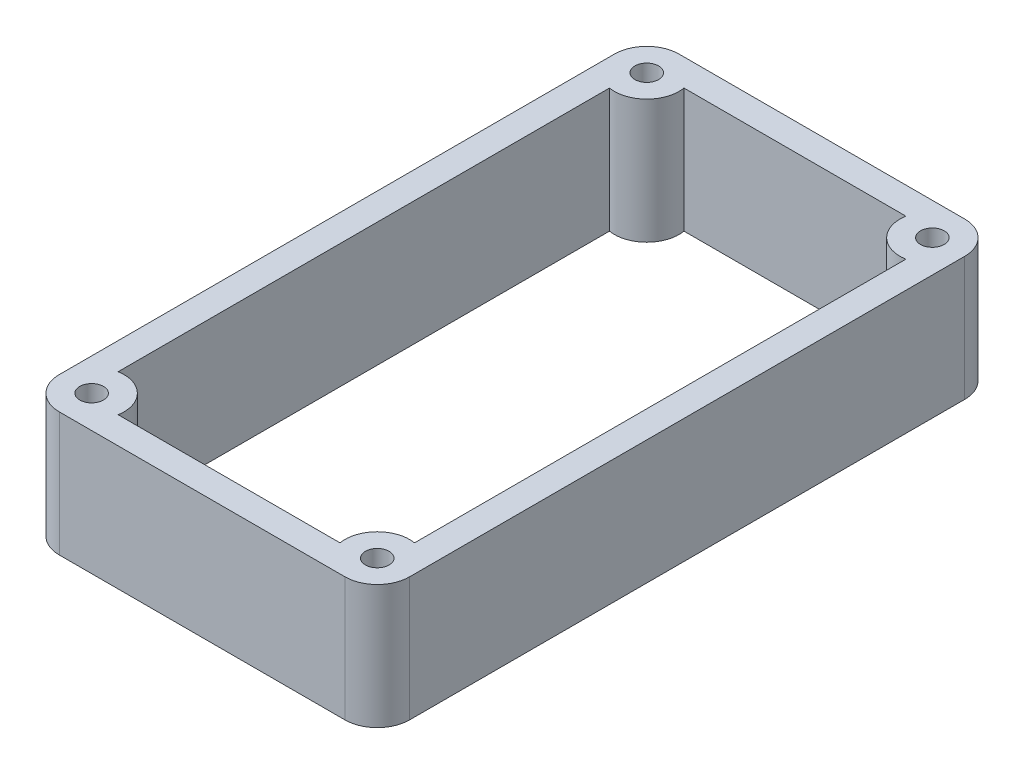
ISO-10303-21;
HEADER;
FILE_DESCRIPTION(('STEP AP214'),'2;1');
FILE_NAME('part.step','',(''),(''),'','','');
FILE_SCHEMA(('AUTOMOTIVE_DESIGN { 1 0 10303 214 1 1 1 1 }'));
ENDSEC;
DATA;
#1=APPLICATION_CONTEXT('core data for automotive mechanical design processes');
#2=APPLICATION_PROTOCOL_DEFINITION('international standard','automotive_design',2000,#1);
#3=PRODUCT_CONTEXT('',#1,'mechanical');
#4=PRODUCT('Part','Part','',(#3));
#5=PRODUCT_RELATED_PRODUCT_CATEGORY('part','',(#4));
#6=PRODUCT_DEFINITION_FORMATION('','',#4);
#7=PRODUCT_DEFINITION_CONTEXT('part definition',#1,'design');
#8=PRODUCT_DEFINITION('design','',#6,#7);
#9=PRODUCT_DEFINITION_SHAPE('','',#8);
#10=(LENGTH_UNIT() NAMED_UNIT(*) SI_UNIT(.MILLI.,.METRE.));
#11=(NAMED_UNIT(*) PLANE_ANGLE_UNIT() SI_UNIT($,.RADIAN.));
#12=(NAMED_UNIT(*) SI_UNIT($,.STERADIAN.) SOLID_ANGLE_UNIT());
#13=UNCERTAINTY_MEASURE_WITH_UNIT(LENGTH_MEASURE(1.E-05),#10,'distance_accuracy_value','');
#14=(GEOMETRIC_REPRESENTATION_CONTEXT(3) GLOBAL_UNCERTAINTY_ASSIGNED_CONTEXT((#13)) GLOBAL_UNIT_ASSIGNED_CONTEXT((#10,
#11,#12)) REPRESENTATION_CONTEXT('',''));
#15=CARTESIAN_POINT('',(0.,0.,0.));
#16=DIRECTION('',(0.,0.,1.));
#17=DIRECTION('',(1.,0.,0.));
#18=AXIS2_PLACEMENT_3D('',#15,#16,#17);
#19=CARTESIAN_POINT('',(0.,23.,0.));
#20=DIRECTION('',(0.,-1.,0.));
#21=DIRECTION('',(0.,0.,-1.));
#22=AXIS2_PLACEMENT_3D('',#19,#20,#21);
#23=PLANE('',#22);
#24=CARTESIAN_POINT('',(-26.5,23.,51.5));
#25=DIRECTION('',(0.,1.,0.));
#26=DIRECTION('',(0.,0.,1.));
#27=AXIS2_PLACEMENT_3D('',#24,#25,#26);
#28=CIRCLE('',#27,2.2);
#29=CARTESIAN_POINT('',(-26.5,23.,53.7));
#30=VERTEX_POINT('',#29);
#31=EDGE_CURVE('E569',#30,#30,#28,.T.);
#32=ORIENTED_EDGE('',*,*,#31,.F.);
#33=EDGE_LOOP('',(#32));
#34=FACE_BOUND('',#33,.T.);
#35=CARTESIAN_POINT('',(26.5,23.,51.5));
#36=DIRECTION('',(0.,1.,0.));
#37=DIRECTION('',(0.,0.,1.));
#38=AXIS2_PLACEMENT_3D('',#35,#36,#37);
#39=CIRCLE('',#38,2.2);
#40=CARTESIAN_POINT('',(26.5,23.,53.7));
#41=VERTEX_POINT('',#40);
#42=EDGE_CURVE('E576',#41,#41,#39,.T.);
#43=ORIENTED_EDGE('',*,*,#42,.F.);
#44=EDGE_LOOP('',(#43));
#45=FACE_BOUND('',#44,.T.);
#46=CARTESIAN_POINT('',(26.5,23.,-51.5));
#47=DIRECTION('',(0.,1.,0.));
#48=DIRECTION('',(0.,0.,1.));
#49=AXIS2_PLACEMENT_3D('',#46,#47,#48);
#50=CIRCLE('',#49,2.2);
#51=CARTESIAN_POINT('',(26.5,23.,-49.3));
#52=VERTEX_POINT('',#51);
#53=EDGE_CURVE('E586',#52,#52,#50,.T.);
#54=ORIENTED_EDGE('',*,*,#53,.F.);
#55=EDGE_LOOP('',(#54));
#56=FACE_BOUND('',#55,.T.);
#57=CARTESIAN_POINT('',(-26.5,23.,-51.5));
#58=DIRECTION('',(0.,1.,0.));
#59=DIRECTION('',(0.,0.,1.));
#60=AXIS2_PLACEMENT_3D('',#57,#58,#59);
#61=CIRCLE('',#60,2.2);
#62=CARTESIAN_POINT('',(-26.5,23.,-49.3));
#63=VERTEX_POINT('',#62);
#64=EDGE_CURVE('E583',#63,#63,#61,.T.);
#65=ORIENTED_EDGE('',*,*,#64,.F.);
#66=EDGE_LOOP('',(#65));
#67=FACE_BOUND('',#66,.T.);
#68=CARTESIAN_POINT('',(26.5,23.,-51.5));
#69=DIRECTION('',(0.,1.,0.));
#70=DIRECTION('',(0.,0.,1.));
#71=AXIS2_PLACEMENT_3D('',#68,#69,#70);
#72=CIRCLE('',#71,5.99999999999999);
#73=CARTESIAN_POINT('',(20.5839202169004,23.,-52.5));
#74=VERTEX_POINT('',#73);
#75=CARTESIAN_POINT('',(27.5,23.,-45.5839202169004));
#76=VERTEX_POINT('',#75);
#77=EDGE_CURVE('E199',#74,#76,#72,.T.);
#78=ORIENTED_EDGE('',*,*,#77,.T.);
#79=DIRECTION('',(0.,0.,-1.));
#80=VECTOR('',#79,1.);
#81=CARTESIAN_POINT('',(27.5,23.,-52.5));
#82=LINE('',#81,#80);
#83=CARTESIAN_POINT('',(27.5,23.,45.5839202169004));
#84=VERTEX_POINT('',#83);
#85=EDGE_CURVE('E61',#84,#76,#82,.T.);
#86=ORIENTED_EDGE('',*,*,#85,.F.);
#87=CARTESIAN_POINT('',(26.5,23.,51.5));
#88=DIRECTION('',(0.,1.,0.));
#89=DIRECTION('',(0.,0.,1.));
#90=AXIS2_PLACEMENT_3D('',#87,#88,#89);
#91=CIRCLE('',#90,5.99999999999999);
#92=CARTESIAN_POINT('',(20.5839202169004,23.,52.5));
#93=VERTEX_POINT('',#92);
#94=EDGE_CURVE('E175',#84,#93,#91,.T.);
#95=ORIENTED_EDGE('',*,*,#94,.T.);
#96=DIRECTION('',(1.,0.,0.));
#97=VECTOR('',#96,1.);
#98=CARTESIAN_POINT('',(-27.5,23.,52.5));
#99=LINE('',#98,#97);
#100=CARTESIAN_POINT('',(-20.5839202169004,23.,52.5));
#101=VERTEX_POINT('',#100);
#102=EDGE_CURVE('E156',#101,#93,#99,.T.);
#103=ORIENTED_EDGE('',*,*,#102,.F.);
#104=CARTESIAN_POINT('',(-26.5,23.,51.5));
#105=DIRECTION('',(0.,1.,0.));
#106=DIRECTION('',(0.,0.,1.));
#107=AXIS2_PLACEMENT_3D('',#104,#105,#106);
#108=CIRCLE('',#107,6.);
#109=CARTESIAN_POINT('',(-27.5,23.,45.5839202169004));
#110=VERTEX_POINT('',#109);
#111=EDGE_CURVE('E189',#101,#110,#108,.T.);
#112=ORIENTED_EDGE('',*,*,#111,.T.);
#113=DIRECTION('',(0.,0.,1.));
#114=VECTOR('',#113,1.);
#115=CARTESIAN_POINT('',(-27.5,23.,-52.5));
#116=LINE('',#115,#114);
#117=CARTESIAN_POINT('',(-27.5,23.,-45.5839202169004));
#118=VERTEX_POINT('',#117);
#119=EDGE_CURVE('E169',#118,#110,#116,.T.);
#120=ORIENTED_EDGE('',*,*,#119,.F.);
#121=CARTESIAN_POINT('',(-26.5,23.,-51.5));
#122=DIRECTION('',(0.,1.,0.));
#123=DIRECTION('',(0.,0.,1.));
#124=AXIS2_PLACEMENT_3D('',#121,#122,#123);
#125=CIRCLE('',#124,6.);
#126=CARTESIAN_POINT('',(-20.5839202169004,23.,-52.5));
#127=VERTEX_POINT('',#126);
#128=EDGE_CURVE('E201',#118,#127,#125,.T.);
#129=ORIENTED_EDGE('',*,*,#128,.T.);
#130=DIRECTION('',(-1.,0.,0.));
#131=VECTOR('',#130,1.);
#132=CARTESIAN_POINT('',(-27.5,23.,-52.5));
#133=LINE('',#132,#131);
#134=EDGE_CURVE('E228',#74,#127,#133,.T.);
#135=ORIENTED_EDGE('',*,*,#134,.F.);
#136=EDGE_LOOP('',(#78,#86,#95,#103,#112,#120,#129,#135));
#137=FACE_BOUND('',#136,.T.);
#138=DIRECTION('',(0.,0.,1.));
#139=VECTOR('',#138,1.);
#140=CARTESIAN_POINT('',(-32.5,23.,57.5));
#141=LINE('',#140,#139);
#142=CARTESIAN_POINT('',(-32.5,23.,-51.5));
#143=VERTEX_POINT('',#142);
#144=CARTESIAN_POINT('',(-32.5,23.,51.5));
#145=VERTEX_POINT('',#144);
#146=EDGE_CURVE('E256',#143,#145,#141,.T.);
#147=ORIENTED_EDGE('',*,*,#146,.T.);
#148=CARTESIAN_POINT('',(-26.5,23.,51.5));
#149=DIRECTION('',(0.,-1.,0.));
#150=DIRECTION('',(0.,0.,-1.));
#151=AXIS2_PLACEMENT_3D('',#148,#149,#150);
#152=CIRCLE('',#151,6.);
#153=CARTESIAN_POINT('',(-26.5,23.,57.5));
#154=VERTEX_POINT('',#153);
#155=EDGE_CURVE('E307',#145,#154,#152,.F.);
#156=ORIENTED_EDGE('',*,*,#155,.T.);
#157=DIRECTION('',(1.,0.,0.));
#158=VECTOR('',#157,1.);
#159=CARTESIAN_POINT('',(-32.5,23.,57.5));
#160=LINE('',#159,#158);
#161=CARTESIAN_POINT('',(26.5,23.,57.5));
#162=VERTEX_POINT('',#161);
#163=EDGE_CURVE('E260',#154,#162,#160,.T.);
#164=ORIENTED_EDGE('',*,*,#163,.T.);
#165=CARTESIAN_POINT('',(26.5,23.,51.5));
#166=DIRECTION('',(0.,-1.,0.));
#167=DIRECTION('',(0.,0.,-1.));
#168=AXIS2_PLACEMENT_3D('',#165,#166,#167);
#169=CIRCLE('',#168,6.);
#170=CARTESIAN_POINT('',(32.5,23.,51.5));
#171=VERTEX_POINT('',#170);
#172=EDGE_CURVE('E304',#162,#171,#169,.F.);
#173=ORIENTED_EDGE('',*,*,#172,.T.);
#174=DIRECTION('',(0.,0.,-1.));
#175=VECTOR('',#174,1.);
#176=CARTESIAN_POINT('',(32.5,23.,57.5));
#177=LINE('',#176,#175);
#178=CARTESIAN_POINT('',(32.5,23.,-51.5));
#179=VERTEX_POINT('',#178);
#180=EDGE_CURVE('E247',#171,#179,#177,.T.);
#181=ORIENTED_EDGE('',*,*,#180,.T.);
#182=CARTESIAN_POINT('',(26.5,23.,-51.5));
#183=DIRECTION('',(0.,-1.,0.));
#184=DIRECTION('',(0.,0.,-1.));
#185=AXIS2_PLACEMENT_3D('',#182,#183,#184);
#186=CIRCLE('',#185,6.);
#187=CARTESIAN_POINT('',(26.5,23.,-57.5));
#188=VERTEX_POINT('',#187);
#189=EDGE_CURVE('E313',#179,#188,#186,.F.);
#190=ORIENTED_EDGE('',*,*,#189,.T.);
#191=DIRECTION('',(-1.,0.,0.));
#192=VECTOR('',#191,1.);
#193=CARTESIAN_POINT('',(-32.5,23.,-57.5));
#194=LINE('',#193,#192);
#195=CARTESIAN_POINT('',(-26.5,23.,-57.5));
#196=VERTEX_POINT('',#195);
#197=EDGE_CURVE('E251',#188,#196,#194,.T.);
#198=ORIENTED_EDGE('',*,*,#197,.T.);
#199=CARTESIAN_POINT('',(-26.5,23.,-51.5));
#200=DIRECTION('',(0.,-1.,0.));
#201=DIRECTION('',(0.,0.,-1.));
#202=AXIS2_PLACEMENT_3D('',#199,#200,#201);
#203=CIRCLE('',#202,6.);
#204=EDGE_CURVE('E310',#196,#143,#203,.F.);
#205=ORIENTED_EDGE('',*,*,#204,.T.);
#206=EDGE_LOOP('',(#147,#156,#164,#173,#181,#190,#198,#205));
#207=FACE_BOUND('',#206,.T.);
#208=ADVANCED_FACE('F45',(#34,#45,#56,#67,#137,#207),#23,.F.);
#209=CARTESIAN_POINT('',(0.,0.,0.));
#210=DIRECTION('',(0.,-1.,0.));
#211=DIRECTION('',(0.,0.,-1.));
#212=AXIS2_PLACEMENT_3D('',#209,#210,#211);
#213=PLANE('',#212);
#214=CARTESIAN_POINT('',(-26.5,0.,51.5));
#215=DIRECTION('',(0.,1.,0.));
#216=DIRECTION('',(0.,0.,1.));
#217=AXIS2_PLACEMENT_3D('',#214,#215,#216);
#218=CIRCLE('',#217,2.2);
#219=CARTESIAN_POINT('',(-26.5,0.,53.7));
#220=VERTEX_POINT('',#219);
#221=EDGE_CURVE('E567',#220,#220,#218,.T.);
#222=ORIENTED_EDGE('',*,*,#221,.T.);
#223=EDGE_LOOP('',(#222));
#224=FACE_BOUND('',#223,.T.);
#225=CARTESIAN_POINT('',(26.5,0.,51.5));
#226=DIRECTION('',(0.,1.,0.));
#227=DIRECTION('',(0.,0.,1.));
#228=AXIS2_PLACEMENT_3D('',#225,#226,#227);
#229=CIRCLE('',#228,2.2);
#230=CARTESIAN_POINT('',(26.5,0.,53.7));
#231=VERTEX_POINT('',#230);
#232=EDGE_CURVE('E571',#231,#231,#229,.T.);
#233=ORIENTED_EDGE('',*,*,#232,.T.);
#234=EDGE_LOOP('',(#233));
#235=FACE_BOUND('',#234,.T.);
#236=CARTESIAN_POINT('',(26.5,0.,-51.5));
#237=DIRECTION('',(0.,1.,0.));
#238=DIRECTION('',(0.,0.,1.));
#239=AXIS2_PLACEMENT_3D('',#236,#237,#238);
#240=CIRCLE('',#239,2.2);
#241=CARTESIAN_POINT('',(26.5,0.,-49.3));
#242=VERTEX_POINT('',#241);
#243=EDGE_CURVE('E591',#242,#242,#240,.T.);
#244=ORIENTED_EDGE('',*,*,#243,.T.);
#245=EDGE_LOOP('',(#244));
#246=FACE_BOUND('',#245,.T.);
#247=CARTESIAN_POINT('',(-26.5,0.,-51.5));
#248=DIRECTION('',(0.,1.,0.));
#249=DIRECTION('',(0.,0.,1.));
#250=AXIS2_PLACEMENT_3D('',#247,#248,#249);
#251=CIRCLE('',#250,2.2);
#252=CARTESIAN_POINT('',(-26.5,0.,-49.3));
#253=VERTEX_POINT('',#252);
#254=EDGE_CURVE('E191',#253,#253,#251,.T.);
#255=ORIENTED_EDGE('',*,*,#254,.T.);
#256=EDGE_LOOP('',(#255));
#257=FACE_BOUND('',#256,.T.);
#258=DIRECTION('',(0.,0.,-1.));
#259=VECTOR('',#258,1.);
#260=CARTESIAN_POINT('',(27.5,0.,-52.5));
#261=LINE('',#260,#259);
#262=CARTESIAN_POINT('',(27.5,0.,45.5839202169004));
#263=VERTEX_POINT('',#262);
#264=CARTESIAN_POINT('',(27.5,0.,-45.5839202169004));
#265=VERTEX_POINT('',#264);
#266=EDGE_CURVE('E225',#263,#265,#261,.T.);
#267=ORIENTED_EDGE('',*,*,#266,.T.);
#268=CARTESIAN_POINT('',(26.5,0.,-51.5));
#269=DIRECTION('',(0.,-1.,0.));
#270=DIRECTION('',(0.,0.,-1.));
#271=AXIS2_PLACEMENT_3D('',#268,#269,#270);
#272=CIRCLE('',#271,5.99999999999999);
#273=CARTESIAN_POINT('',(20.5839202169004,0.,-52.5));
#274=VERTEX_POINT('',#273);
#275=EDGE_CURVE('E195',#274,#265,#272,.F.);
#276=ORIENTED_EDGE('',*,*,#275,.F.);
#277=DIRECTION('',(-1.,0.,0.));
#278=VECTOR('',#277,1.);
#279=CARTESIAN_POINT('',(-27.5,0.,-52.5));
#280=LINE('',#279,#278);
#281=CARTESIAN_POINT('',(-20.5839202169004,0.,-52.5));
#282=VERTEX_POINT('',#281);
#283=EDGE_CURVE('E237',#274,#282,#280,.T.);
#284=ORIENTED_EDGE('',*,*,#283,.T.);
#285=CARTESIAN_POINT('',(-26.5,0.,-51.5));
#286=DIRECTION('',(0.,-1.,0.));
#287=DIRECTION('',(0.,0.,-1.));
#288=AXIS2_PLACEMENT_3D('',#285,#286,#287);
#289=CIRCLE('',#288,6.);
#290=CARTESIAN_POINT('',(-27.5,0.,-45.5839202169004));
#291=VERTEX_POINT('',#290);
#292=EDGE_CURVE('E208',#291,#282,#289,.F.);
#293=ORIENTED_EDGE('',*,*,#292,.F.);
#294=DIRECTION('',(0.,0.,1.));
#295=VECTOR('',#294,1.);
#296=CARTESIAN_POINT('',(-27.5,0.,-52.5));
#297=LINE('',#296,#295);
#298=CARTESIAN_POINT('',(-27.5,0.,45.5839202169004));
#299=VERTEX_POINT('',#298);
#300=EDGE_CURVE('E241',#291,#299,#297,.T.);
#301=ORIENTED_EDGE('',*,*,#300,.T.);
#302=CARTESIAN_POINT('',(-26.5,0.,51.5));
#303=DIRECTION('',(0.,-1.,0.));
#304=DIRECTION('',(0.,0.,-1.));
#305=AXIS2_PLACEMENT_3D('',#302,#303,#304);
#306=CIRCLE('',#305,6.);
#307=CARTESIAN_POINT('',(-20.5839202169004,0.,52.5));
#308=VERTEX_POINT('',#307);
#309=EDGE_CURVE('E184',#308,#299,#306,.F.);
#310=ORIENTED_EDGE('',*,*,#309,.F.);
#311=DIRECTION('',(1.,0.,0.));
#312=VECTOR('',#311,1.);
#313=CARTESIAN_POINT('',(-27.5,0.,52.5));
#314=LINE('',#313,#312);
#315=CARTESIAN_POINT('',(20.5839202169004,0.,52.5));
#316=VERTEX_POINT('',#315);
#317=EDGE_CURVE('E229',#308,#316,#314,.T.);
#318=ORIENTED_EDGE('',*,*,#317,.T.);
#319=CARTESIAN_POINT('',(26.5,0.,51.5));
#320=DIRECTION('',(0.,-1.,0.));
#321=DIRECTION('',(0.,0.,-1.));
#322=AXIS2_PLACEMENT_3D('',#319,#320,#321);
#323=CIRCLE('',#322,5.99999999999999);
#324=EDGE_CURVE('E177',#263,#316,#323,.F.);
#325=ORIENTED_EDGE('',*,*,#324,.F.);
#326=EDGE_LOOP('',(#267,#276,#284,#293,#301,#310,#318,#325));
#327=FACE_BOUND('',#326,.T.);
#328=CARTESIAN_POINT('',(26.5,0.,-51.5));
#329=DIRECTION('',(0.,-1.,0.));
#330=DIRECTION('',(0.,0.,-1.));
#331=AXIS2_PLACEMENT_3D('',#328,#329,#330);
#332=CIRCLE('',#331,6.);
#333=CARTESIAN_POINT('',(26.5,0.,-57.5));
#334=VERTEX_POINT('',#333);
#335=CARTESIAN_POINT('',(32.5,0.,-51.5));
#336=VERTEX_POINT('',#335);
#337=EDGE_CURVE('E294',#334,#336,#332,.T.);
#338=ORIENTED_EDGE('',*,*,#337,.T.);
#339=DIRECTION('',(0.,0.,-1.));
#340=VECTOR('',#339,1.);
#341=CARTESIAN_POINT('',(32.5,0.,57.5));
#342=LINE('',#341,#340);
#343=CARTESIAN_POINT('',(32.5,0.,51.5));
#344=VERTEX_POINT('',#343);
#345=EDGE_CURVE('E168',#344,#336,#342,.T.);
#346=ORIENTED_EDGE('',*,*,#345,.F.);
#347=CARTESIAN_POINT('',(26.5,0.,51.5));
#348=DIRECTION('',(0.,-1.,0.));
#349=DIRECTION('',(0.,0.,-1.));
#350=AXIS2_PLACEMENT_3D('',#347,#348,#349);
#351=CIRCLE('',#350,6.);
#352=CARTESIAN_POINT('',(26.5,0.,57.5));
#353=VERTEX_POINT('',#352);
#354=EDGE_CURVE('E285',#344,#353,#351,.T.);
#355=ORIENTED_EDGE('',*,*,#354,.T.);
#356=DIRECTION('',(1.,0.,0.));
#357=VECTOR('',#356,1.);
#358=CARTESIAN_POINT('',(-32.5,0.,57.5));
#359=LINE('',#358,#357);
#360=CARTESIAN_POINT('',(-26.5,0.,57.5));
#361=VERTEX_POINT('',#360);
#362=EDGE_CURVE('E252',#361,#353,#359,.T.);
#363=ORIENTED_EDGE('',*,*,#362,.F.);
#364=CARTESIAN_POINT('',(-26.5,0.,51.5));
#365=DIRECTION('',(0.,-1.,0.));
#366=DIRECTION('',(0.,0.,-1.));
#367=AXIS2_PLACEMENT_3D('',#364,#365,#366);
#368=CIRCLE('',#367,6.);
#369=CARTESIAN_POINT('',(-32.5,0.,51.5));
#370=VERTEX_POINT('',#369);
#371=EDGE_CURVE('E288',#361,#370,#368,.T.);
#372=ORIENTED_EDGE('',*,*,#371,.T.);
#373=DIRECTION('',(0.,0.,1.));
#374=VECTOR('',#373,1.);
#375=CARTESIAN_POINT('',(-32.5,0.,57.5));
#376=LINE('',#375,#374);
#377=CARTESIAN_POINT('',(-32.5,0.,-51.5));
#378=VERTEX_POINT('',#377);
#379=EDGE_CURVE('E272',#378,#370,#376,.T.);
#380=ORIENTED_EDGE('',*,*,#379,.F.);
#381=CARTESIAN_POINT('',(-26.5,0.,-51.5));
#382=DIRECTION('',(0.,-1.,0.));
#383=DIRECTION('',(0.,0.,-1.));
#384=AXIS2_PLACEMENT_3D('',#381,#382,#383);
#385=CIRCLE('',#384,6.);
#386=CARTESIAN_POINT('',(-26.5,0.,-57.5));
#387=VERTEX_POINT('',#386);
#388=EDGE_CURVE('E291',#378,#387,#385,.T.);
#389=ORIENTED_EDGE('',*,*,#388,.T.);
#390=DIRECTION('',(-1.,0.,0.));
#391=VECTOR('',#390,1.);
#392=CARTESIAN_POINT('',(-32.5,0.,-57.5));
#393=LINE('',#392,#391);
#394=EDGE_CURVE('E268',#334,#387,#393,.T.);
#395=ORIENTED_EDGE('',*,*,#394,.F.);
#396=EDGE_LOOP('',(#338,#346,#355,#363,#372,#380,#389,#395));
#397=FACE_BOUND('',#396,.T.);
#398=ADVANCED_FACE('F339',(#224,#235,#246,#257,#327,#397),#213,.T.);
#399=CARTESIAN_POINT('',(32.5,23.,57.5));
#400=DIRECTION('',(-1.,0.,0.));
#401=DIRECTION('',(0.,0.,1.));
#402=AXIS2_PLACEMENT_3D('',#399,#400,#401);
#403=PLANE('',#402);
#404=ORIENTED_EDGE('',*,*,#345,.T.);
#405=DIRECTION('',(0.,-1.,0.));
#406=VECTOR('',#405,1.);
#407=CARTESIAN_POINT('',(32.5,23.,-51.5));
#408=LINE('',#407,#406);
#409=EDGE_CURVE('E301',#336,#179,#408,.F.);
#410=ORIENTED_EDGE('',*,*,#409,.T.);
#411=ORIENTED_EDGE('',*,*,#180,.F.);
#412=DIRECTION('',(0.,-1.,0.));
#413=VECTOR('',#412,1.);
#414=CARTESIAN_POINT('',(32.5,23.,51.5));
#415=LINE('',#414,#413);
#416=EDGE_CURVE('E297',#171,#344,#415,.T.);
#417=ORIENTED_EDGE('',*,*,#416,.T.);
#418=EDGE_LOOP('',(#404,#410,#411,#417));
#419=FACE_BOUND('',#418,.T.);
#420=ADVANCED_FACE('F372',(#419),#403,.F.);
#421=CARTESIAN_POINT('',(-32.5,23.,-57.5));
#422=DIRECTION('',(0.,0.,1.));
#423=DIRECTION('',(1.,0.,0.));
#424=AXIS2_PLACEMENT_3D('',#421,#422,#423);
#425=PLANE('',#424);
#426=ORIENTED_EDGE('',*,*,#197,.F.);
#427=DIRECTION('',(0.,-1.,0.));
#428=VECTOR('',#427,1.);
#429=CARTESIAN_POINT('',(26.5,23.,-57.5));
#430=LINE('',#429,#428);
#431=EDGE_CURVE('E281',#188,#334,#430,.T.);
#432=ORIENTED_EDGE('',*,*,#431,.T.);
#433=ORIENTED_EDGE('',*,*,#394,.T.);
#434=DIRECTION('',(0.,-1.,0.));
#435=VECTOR('',#434,1.);
#436=CARTESIAN_POINT('',(-26.5,23.,-57.5));
#437=LINE('',#436,#435);
#438=EDGE_CURVE('E264',#387,#196,#437,.F.);
#439=ORIENTED_EDGE('',*,*,#438,.T.);
#440=EDGE_LOOP('',(#426,#432,#433,#439));
#441=FACE_BOUND('',#440,.T.);
#442=ADVANCED_FACE('F380',(#441),#425,.F.);
#443=CARTESIAN_POINT('',(-32.5,23.,57.5));
#444=DIRECTION('',(1.,0.,0.));
#445=DIRECTION('',(0.,0.,-1.));
#446=AXIS2_PLACEMENT_3D('',#443,#444,#445);
#447=PLANE('',#446);
#448=ORIENTED_EDGE('',*,*,#146,.F.);
#449=DIRECTION('',(0.,-1.,0.));
#450=VECTOR('',#449,1.);
#451=CARTESIAN_POINT('',(-32.5,23.,-51.5));
#452=LINE('',#451,#450);
#453=EDGE_CURVE('E319',#143,#378,#452,.T.);
#454=ORIENTED_EDGE('',*,*,#453,.T.);
#455=ORIENTED_EDGE('',*,*,#379,.T.);
#456=DIRECTION('',(0.,-1.,0.));
#457=VECTOR('',#456,1.);
#458=CARTESIAN_POINT('',(-32.5,23.,51.5));
#459=LINE('',#458,#457);
#460=EDGE_CURVE('E316',#370,#145,#459,.F.);
#461=ORIENTED_EDGE('',*,*,#460,.T.);
#462=EDGE_LOOP('',(#448,#454,#455,#461));
#463=FACE_BOUND('',#462,.T.);
#464=ADVANCED_FACE('F362',(#463),#447,.F.);
#465=CARTESIAN_POINT('',(-32.5,23.,57.5));
#466=DIRECTION('',(0.,0.,-1.));
#467=DIRECTION('',(-1.,0.,0.));
#468=AXIS2_PLACEMENT_3D('',#465,#466,#467);
#469=PLANE('',#468);
#470=ORIENTED_EDGE('',*,*,#163,.F.);
#471=DIRECTION('',(0.,-1.,0.));
#472=VECTOR('',#471,1.);
#473=CARTESIAN_POINT('',(-26.5,23.,57.5));
#474=LINE('',#473,#472);
#475=EDGE_CURVE('E179',#154,#361,#474,.T.);
#476=ORIENTED_EDGE('',*,*,#475,.T.);
#477=ORIENTED_EDGE('',*,*,#362,.T.);
#478=DIRECTION('',(0.,-1.,0.));
#479=VECTOR('',#478,1.);
#480=CARTESIAN_POINT('',(26.5,23.,57.5));
#481=LINE('',#480,#479);
#482=EDGE_CURVE('E323',#353,#162,#481,.F.);
#483=ORIENTED_EDGE('',*,*,#482,.T.);
#484=EDGE_LOOP('',(#470,#476,#477,#483));
#485=FACE_BOUND('',#484,.T.);
#486=ADVANCED_FACE('F354',(#485),#469,.F.);
#487=CARTESIAN_POINT('',(27.5,23.,-52.5));
#488=DIRECTION('',(-1.,0.,0.));
#489=DIRECTION('',(0.,0.,1.));
#490=AXIS2_PLACEMENT_3D('',#487,#488,#489);
#491=PLANE('',#490);
#492=DIRECTION('',(0.,1.,0.));
#493=VECTOR('',#492,1.);
#494=CARTESIAN_POINT('',(27.5,-16.9705627484771,-45.5839202169004));
#495=LINE('',#494,#493);
#496=EDGE_CURVE('E222',#265,#76,#495,.T.);
#497=ORIENTED_EDGE('',*,*,#496,.F.);
#498=ORIENTED_EDGE('',*,*,#266,.F.);
#499=DIRECTION('',(0.,1.,0.));
#500=VECTOR('',#499,1.);
#501=CARTESIAN_POINT('',(27.5,-16.9705627484771,45.5839202169004));
#502=LINE('',#501,#500);
#503=EDGE_CURVE('E66',#84,#263,#502,.F.);
#504=ORIENTED_EDGE('',*,*,#503,.F.);
#505=ORIENTED_EDGE('',*,*,#85,.T.);
#506=EDGE_LOOP('',(#497,#498,#504,#505));
#507=FACE_BOUND('',#506,.T.);
#508=ADVANCED_FACE('F352',(#507),#491,.T.);
#509=CARTESIAN_POINT('',(-27.5,23.,-52.5));
#510=DIRECTION('',(0.,0.,1.));
#511=DIRECTION('',(1.,0.,0.));
#512=AXIS2_PLACEMENT_3D('',#509,#510,#511);
#513=PLANE('',#512);
#514=DIRECTION('',(0.,1.,0.));
#515=VECTOR('',#514,1.);
#516=CARTESIAN_POINT('',(20.5839202169004,-16.9705627484771,-52.5));
#517=LINE('',#516,#515);
#518=EDGE_CURVE('E11',#74,#274,#517,.F.);
#519=ORIENTED_EDGE('',*,*,#518,.F.);
#520=ORIENTED_EDGE('',*,*,#134,.T.);
#521=DIRECTION('',(0.,1.,0.));
#522=VECTOR('',#521,1.);
#523=CARTESIAN_POINT('',(-20.5839202169004,-16.9705627484771,-52.5));
#524=LINE('',#523,#522);
#525=EDGE_CURVE('E218',#282,#127,#524,.T.);
#526=ORIENTED_EDGE('',*,*,#525,.F.);
#527=ORIENTED_EDGE('',*,*,#283,.F.);
#528=EDGE_LOOP('',(#519,#520,#526,#527));
#529=FACE_BOUND('',#528,.T.);
#530=ADVANCED_FACE('F344',(#529),#513,.T.);
#531=CARTESIAN_POINT('',(-27.5,23.,-52.5));
#532=DIRECTION('',(1.,0.,0.));
#533=DIRECTION('',(0.,0.,-1.));
#534=AXIS2_PLACEMENT_3D('',#531,#532,#533);
#535=PLANE('',#534);
#536=DIRECTION('',(0.,1.,0.));
#537=VECTOR('',#536,1.);
#538=CARTESIAN_POINT('',(-27.5,-16.9705627484771,45.5839202169004));
#539=LINE('',#538,#537);
#540=EDGE_CURVE('E214',#299,#110,#539,.T.);
#541=ORIENTED_EDGE('',*,*,#540,.F.);
#542=ORIENTED_EDGE('',*,*,#300,.F.);
#543=DIRECTION('',(0.,1.,0.));
#544=VECTOR('',#543,1.);
#545=CARTESIAN_POINT('',(-27.5,-16.9705627484771,-45.5839202169004));
#546=LINE('',#545,#544);
#547=EDGE_CURVE('E54',#118,#291,#546,.F.);
#548=ORIENTED_EDGE('',*,*,#547,.F.);
#549=ORIENTED_EDGE('',*,*,#119,.T.);
#550=EDGE_LOOP('',(#541,#542,#548,#549));
#551=FACE_BOUND('',#550,.T.);
#552=ADVANCED_FACE('F349',(#551),#535,.T.);
#553=CARTESIAN_POINT('',(-27.5,23.,52.5));
#554=DIRECTION('',(0.,0.,-1.));
#555=DIRECTION('',(-1.,0.,0.));
#556=AXIS2_PLACEMENT_3D('',#553,#554,#555);
#557=PLANE('',#556);
#558=DIRECTION('',(0.,1.,0.));
#559=VECTOR('',#558,1.);
#560=CARTESIAN_POINT('',(-20.5839202169004,-16.9705627484771,52.5));
#561=LINE('',#560,#559);
#562=EDGE_CURVE('E162',#101,#308,#561,.F.);
#563=ORIENTED_EDGE('',*,*,#562,.F.);
#564=ORIENTED_EDGE('',*,*,#102,.T.);
#565=DIRECTION('',(0.,1.,0.));
#566=VECTOR('',#565,1.);
#567=CARTESIAN_POINT('',(20.5839202169004,-16.9705627484771,52.5));
#568=LINE('',#567,#566);
#569=EDGE_CURVE('E159',#316,#93,#568,.T.);
#570=ORIENTED_EDGE('',*,*,#569,.F.);
#571=ORIENTED_EDGE('',*,*,#317,.F.);
#572=EDGE_LOOP('',(#563,#564,#570,#571));
#573=FACE_BOUND('',#572,.T.);
#574=ADVANCED_FACE('F158',(#573),#557,.T.);
#575=CARTESIAN_POINT('',(26.5,23.,-51.5));
#576=DIRECTION('',(0.,-1.,0.));
#577=DIRECTION('',(0.,0.,-1.));
#578=AXIS2_PLACEMENT_3D('',#575,#576,#577);
#579=CYLINDRICAL_SURFACE('',#578,6.);
#580=ORIENTED_EDGE('',*,*,#189,.F.);
#581=ORIENTED_EDGE('',*,*,#409,.F.);
#582=ORIENTED_EDGE('',*,*,#337,.F.);
#583=ORIENTED_EDGE('',*,*,#431,.F.);
#584=EDGE_LOOP('',(#580,#581,#582,#583));
#585=FACE_BOUND('',#584,.T.);
#586=ADVANCED_FACE('F388',(#585),#579,.T.);
#587=CARTESIAN_POINT('',(-26.5,23.,-51.5));
#588=DIRECTION('',(0.,-1.,0.));
#589=DIRECTION('',(0.,0.,-1.));
#590=AXIS2_PLACEMENT_3D('',#587,#588,#589);
#591=CYLINDRICAL_SURFACE('',#590,6.);
#592=ORIENTED_EDGE('',*,*,#204,.F.);
#593=ORIENTED_EDGE('',*,*,#438,.F.);
#594=ORIENTED_EDGE('',*,*,#388,.F.);
#595=ORIENTED_EDGE('',*,*,#453,.F.);
#596=EDGE_LOOP('',(#592,#593,#594,#595));
#597=FACE_BOUND('',#596,.T.);
#598=ADVANCED_FACE('F391',(#597),#591,.T.);
#599=CARTESIAN_POINT('',(-26.5,23.,51.5));
#600=DIRECTION('',(0.,-1.,0.));
#601=DIRECTION('',(0.,0.,-1.));
#602=AXIS2_PLACEMENT_3D('',#599,#600,#601);
#603=CYLINDRICAL_SURFACE('',#602,6.);
#604=ORIENTED_EDGE('',*,*,#155,.F.);
#605=ORIENTED_EDGE('',*,*,#460,.F.);
#606=ORIENTED_EDGE('',*,*,#371,.F.);
#607=ORIENTED_EDGE('',*,*,#475,.F.);
#608=EDGE_LOOP('',(#604,#605,#606,#607));
#609=FACE_BOUND('',#608,.T.);
#610=ADVANCED_FACE('F394',(#609),#603,.T.);
#611=CARTESIAN_POINT('',(26.5,23.,51.5));
#612=DIRECTION('',(0.,-1.,0.));
#613=DIRECTION('',(0.,0.,-1.));
#614=AXIS2_PLACEMENT_3D('',#611,#612,#613);
#615=CYLINDRICAL_SURFACE('',#614,6.);
#616=ORIENTED_EDGE('',*,*,#172,.F.);
#617=ORIENTED_EDGE('',*,*,#482,.F.);
#618=ORIENTED_EDGE('',*,*,#354,.F.);
#619=ORIENTED_EDGE('',*,*,#416,.F.);
#620=EDGE_LOOP('',(#616,#617,#618,#619));
#621=FACE_BOUND('',#620,.T.);
#622=ADVANCED_FACE('F47',(#621),#615,.T.);
#623=CARTESIAN_POINT('',(26.5,-16.9705627484771,51.5));
#624=DIRECTION('',(0.,1.,0.));
#625=DIRECTION('',(0.,0.,1.));
#626=AXIS2_PLACEMENT_3D('',#623,#624,#625);
#627=CYLINDRICAL_SURFACE('',#626,5.99999999999999);
#628=ORIENTED_EDGE('',*,*,#94,.F.);
#629=ORIENTED_EDGE('',*,*,#503,.T.);
#630=ORIENTED_EDGE('',*,*,#324,.T.);
#631=ORIENTED_EDGE('',*,*,#569,.T.);
#632=EDGE_LOOP('',(#628,#629,#630,#631));
#633=FACE_BOUND('',#632,.T.);
#634=ADVANCED_FACE('F174',(#633),#627,.T.);
#635=CARTESIAN_POINT('',(-26.5,-16.9705627484771,51.5));
#636=DIRECTION('',(0.,1.,0.));
#637=DIRECTION('',(0.,0.,1.));
#638=AXIS2_PLACEMENT_3D('',#635,#636,#637);
#639=CYLINDRICAL_SURFACE('',#638,6.);
#640=ORIENTED_EDGE('',*,*,#309,.T.);
#641=ORIENTED_EDGE('',*,*,#540,.T.);
#642=ORIENTED_EDGE('',*,*,#111,.F.);
#643=ORIENTED_EDGE('',*,*,#562,.T.);
#644=EDGE_LOOP('',(#640,#641,#642,#643));
#645=FACE_BOUND('',#644,.T.);
#646=ADVANCED_FACE('F351',(#645),#639,.T.);
#647=CARTESIAN_POINT('',(-26.5,-16.9705627484771,-51.5));
#648=DIRECTION('',(0.,1.,0.));
#649=DIRECTION('',(0.,0.,1.));
#650=AXIS2_PLACEMENT_3D('',#647,#648,#649);
#651=CYLINDRICAL_SURFACE('',#650,6.);
#652=ORIENTED_EDGE('',*,*,#292,.T.);
#653=ORIENTED_EDGE('',*,*,#525,.T.);
#654=ORIENTED_EDGE('',*,*,#128,.F.);
#655=ORIENTED_EDGE('',*,*,#547,.T.);
#656=EDGE_LOOP('',(#652,#653,#654,#655));
#657=FACE_BOUND('',#656,.T.);
#658=ADVANCED_FACE('F335',(#657),#651,.T.);
#659=CARTESIAN_POINT('',(26.5,-16.9705627484771,-51.5));
#660=DIRECTION('',(0.,1.,0.));
#661=DIRECTION('',(0.,0.,1.));
#662=AXIS2_PLACEMENT_3D('',#659,#660,#661);
#663=CYLINDRICAL_SURFACE('',#662,5.99999999999999);
#664=ORIENTED_EDGE('',*,*,#275,.T.);
#665=ORIENTED_EDGE('',*,*,#496,.T.);
#666=ORIENTED_EDGE('',*,*,#77,.F.);
#667=ORIENTED_EDGE('',*,*,#518,.T.);
#668=EDGE_LOOP('',(#664,#665,#666,#667));
#669=FACE_BOUND('',#668,.T.);
#670=ADVANCED_FACE('F348',(#669),#663,.T.);
#671=CARTESIAN_POINT('',(-26.5,0.,-51.5));
#672=DIRECTION('',(0.,1.,0.));
#673=DIRECTION('',(0.,0.,1.));
#674=AXIS2_PLACEMENT_3D('',#671,#672,#673);
#675=CYLINDRICAL_SURFACE('',#674,2.2);
#676=ORIENTED_EDGE('',*,*,#254,.F.);
#677=EDGE_LOOP('',(#676));
#678=FACE_BOUND('',#677,.T.);
#679=ORIENTED_EDGE('',*,*,#64,.T.);
#680=EDGE_LOOP('',(#679));
#681=FACE_BOUND('',#680,.T.);
#682=ADVANCED_FACE('F432',(#678,#681),#675,.F.);
#683=CARTESIAN_POINT('',(26.5,0.,-51.5));
#684=DIRECTION('',(0.,1.,0.));
#685=DIRECTION('',(0.,0.,1.));
#686=AXIS2_PLACEMENT_3D('',#683,#684,#685);
#687=CYLINDRICAL_SURFACE('',#686,2.2);
#688=ORIENTED_EDGE('',*,*,#243,.F.);
#689=EDGE_LOOP('',(#688));
#690=FACE_BOUND('',#689,.T.);
#691=ORIENTED_EDGE('',*,*,#53,.T.);
#692=EDGE_LOOP('',(#691));
#693=FACE_BOUND('',#692,.T.);
#694=ADVANCED_FACE('F533',(#690,#693),#687,.F.);
#695=CARTESIAN_POINT('',(26.5,0.,51.5));
#696=DIRECTION('',(0.,1.,0.));
#697=DIRECTION('',(0.,0.,1.));
#698=AXIS2_PLACEMENT_3D('',#695,#696,#697);
#699=CYLINDRICAL_SURFACE('',#698,2.2);
#700=ORIENTED_EDGE('',*,*,#232,.F.);
#701=EDGE_LOOP('',(#700));
#702=FACE_BOUND('',#701,.T.);
#703=ORIENTED_EDGE('',*,*,#42,.T.);
#704=EDGE_LOOP('',(#703));
#705=FACE_BOUND('',#704,.T.);
#706=ADVANCED_FACE('F542',(#702,#705),#699,.F.);
#707=CARTESIAN_POINT('',(-26.5,0.,51.5));
#708=DIRECTION('',(0.,1.,0.));
#709=DIRECTION('',(0.,0.,1.));
#710=AXIS2_PLACEMENT_3D('',#707,#708,#709);
#711=CYLINDRICAL_SURFACE('',#710,2.2);
#712=ORIENTED_EDGE('',*,*,#221,.F.);
#713=EDGE_LOOP('',(#712));
#714=FACE_BOUND('',#713,.T.);
#715=ORIENTED_EDGE('',*,*,#31,.T.);
#716=EDGE_LOOP('',(#715));
#717=FACE_BOUND('',#716,.T.);
#718=ADVANCED_FACE('F552',(#714,#717),#711,.F.);
#719=CLOSED_SHELL('',(#208,#398,#420,#442,#464,#486,#508,#530,#552,#574,#586,#598,#610,#622,
#634,#646,#658,#670,#682,#694,#706,#718));
#720=MANIFOLD_SOLID_BREP('B2',#719);
#721=ADVANCED_BREP_SHAPE_REPRESENTATION('',(#18,#720),#14);
#722=SHAPE_DEFINITION_REPRESENTATION(#9,#721);
ENDSEC;
END-ISO-10303-21;
